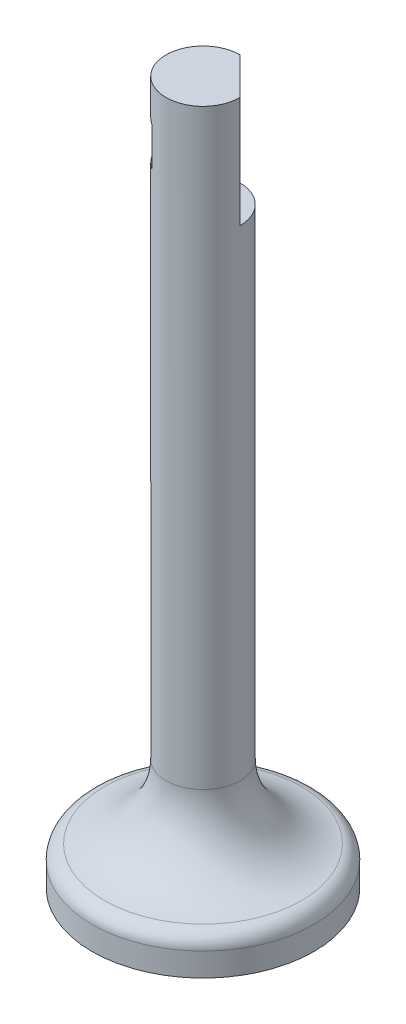
ISO-10303-21;
HEADER;
FILE_DESCRIPTION(('STEP AP214'),'2;1');
FILE_NAME('part.step','',(''),(''),'','','');
FILE_SCHEMA(('AUTOMOTIVE_DESIGN { 1 0 10303 214 1 1 1 1 }'));
ENDSEC;
DATA;
#1=APPLICATION_CONTEXT('core data for automotive mechanical design processes');
#2=APPLICATION_PROTOCOL_DEFINITION('international standard','automotive_design',2000,#1);
#3=PRODUCT_CONTEXT('',#1,'mechanical');
#4=PRODUCT('Part','Part','',(#3));
#5=PRODUCT_RELATED_PRODUCT_CATEGORY('part','',(#4));
#6=PRODUCT_DEFINITION_FORMATION('','',#4);
#7=PRODUCT_DEFINITION_CONTEXT('part definition',#1,'design');
#8=PRODUCT_DEFINITION('design','',#6,#7);
#9=PRODUCT_DEFINITION_SHAPE('','',#8);
#10=(LENGTH_UNIT() NAMED_UNIT(*) SI_UNIT(.MILLI.,.METRE.));
#11=(NAMED_UNIT(*) PLANE_ANGLE_UNIT() SI_UNIT($,.RADIAN.));
#12=(NAMED_UNIT(*) SI_UNIT($,.STERADIAN.) SOLID_ANGLE_UNIT());
#13=UNCERTAINTY_MEASURE_WITH_UNIT(LENGTH_MEASURE(1.E-05),#10,'distance_accuracy_value','');
#14=(GEOMETRIC_REPRESENTATION_CONTEXT(3) GLOBAL_UNCERTAINTY_ASSIGNED_CONTEXT((#13)) GLOBAL_UNIT_ASSIGNED_CONTEXT((#10,
#11,#12)) REPRESENTATION_CONTEXT('',''));
#15=CARTESIAN_POINT('',(0.,0.,0.));
#16=DIRECTION('',(0.,0.,1.));
#17=DIRECTION('',(1.,0.,0.));
#18=AXIS2_PLACEMENT_3D('',#15,#16,#17);
#19=CARTESIAN_POINT('',(0.,0.,0.));
#20=DIRECTION('',(0.,1.,0.));
#21=DIRECTION('',(0.,0.,1.));
#22=AXIS2_PLACEMENT_3D('',#19,#20,#21);
#23=PLANE('',#22);
#24=CARTESIAN_POINT('',(0.,0.,0.));
#25=DIRECTION('',(0.,-1.,0.));
#26=DIRECTION('',(0.,0.,-1.));
#27=AXIS2_PLACEMENT_3D('',#24,#25,#26);
#28=CIRCLE('',#27,13.5);
#29=CARTESIAN_POINT('',(0.,0.,-13.5));
#30=VERTEX_POINT('',#29);
#31=EDGE_CURVE('E301',#30,#30,#28,.T.);
#32=ORIENTED_EDGE('',*,*,#31,.F.);
#33=EDGE_LOOP('',(#32));
#34=FACE_BOUND('',#33,.T.);
#35=CARTESIAN_POINT('',(0.,0.,0.));
#36=DIRECTION('',(0.,1.,0.));
#37=DIRECTION('',(0.,0.,1.));
#38=AXIS2_PLACEMENT_3D('',#35,#36,#37);
#39=CIRCLE('',#38,15.);
#40=CARTESIAN_POINT('',(0.,0.,15.));
#41=VERTEX_POINT('',#40);
#42=EDGE_CURVE('E249',#41,#41,#39,.T.);
#43=ORIENTED_EDGE('',*,*,#42,.F.);
#44=EDGE_LOOP('',(#43));
#45=FACE_BOUND('',#44,.T.);
#46=ADVANCED_FACE('F34',(#34,#45),#23,.F.);
#47=CARTESIAN_POINT('',(0.,5.,0.));
#48=DIRECTION('',(0.,-1.,0.));
#49=DIRECTION('',(0.,0.,-1.));
#50=AXIS2_PLACEMENT_3D('',#47,#48,#49);
#51=CYLINDRICAL_SURFACE('',#50,15.);
#52=CARTESIAN_POINT('',(0.,3.16784043380077,0.));
#53=DIRECTION('',(0.,-1.,0.));
#54=DIRECTION('',(0.,0.,-1.));
#55=AXIS2_PLACEMENT_3D('',#52,#53,#54);
#56=CIRCLE('',#55,15.);
#57=CARTESIAN_POINT('',(0.,3.16784043380077,-15.));
#58=VERTEX_POINT('',#57);
#59=EDGE_CURVE('E11',#58,#58,#56,.T.);
#60=ORIENTED_EDGE('',*,*,#59,.T.);
#61=EDGE_LOOP('',(#60));
#62=FACE_BOUND('',#61,.T.);
#63=ORIENTED_EDGE('',*,*,#42,.T.);
#64=EDGE_LOOP('',(#63));
#65=FACE_BOUND('',#64,.T.);
#66=ADVANCED_FACE('F273',(#62,#65),#51,.T.);
#67=CARTESIAN_POINT('',(0.,95.,0.));
#68=DIRECTION('',(0.,-1.,0.));
#69=DIRECTION('',(0.,0.,-1.));
#70=AXIS2_PLACEMENT_3D('',#67,#68,#69);
#71=CYLINDRICAL_SURFACE('',#70,5.);
#72=CARTESIAN_POINT('',(0.,15.,0.));
#73=DIRECTION('',(0.,1.,0.));
#74=DIRECTION('',(0.,0.,1.));
#75=AXIS2_PLACEMENT_3D('',#72,#73,#74);
#76=CIRCLE('',#75,5.);
#77=CARTESIAN_POINT('',(0.,15.,5.));
#78=VERTEX_POINT('',#77);
#79=EDGE_CURVE('E252',#78,#78,#76,.T.);
#80=ORIENTED_EDGE('',*,*,#79,.T.);
#81=EDGE_LOOP('',(#80));
#82=FACE_BOUND('',#81,.T.);
#83=CARTESIAN_POINT('',(0.,90.1,0.));
#84=DIRECTION('',(0.,1.,0.));
#85=DIRECTION('',(0.,0.,1.));
#86=AXIS2_PLACEMENT_3D('',#83,#84,#85);
#87=CIRCLE('',#86,5.);
#88=CARTESIAN_POINT('',(-4.1712083963243,90.1,2.7569948339512));
#89=VERTEX_POINT('',#88);
#90=CARTESIAN_POINT('',(-2.75699483395121,90.1,4.1712083963243));
#91=VERTEX_POINT('',#90);
#92=EDGE_CURVE('E228',#89,#91,#87,.T.);
#93=ORIENTED_EDGE('',*,*,#92,.T.);
#94=DIRECTION('',(0.,-1.,0.));
#95=VECTOR('',#94,1.);
#96=CARTESIAN_POINT('',(-2.75699483395121,95.,4.1712083963243));
#97=LINE('',#96,#95);
#98=CARTESIAN_POINT('',(-2.75699483395121,84.9,4.1712083963243));
#99=VERTEX_POINT('',#98);
#100=EDGE_CURVE('E231',#91,#99,#97,.T.);
#101=ORIENTED_EDGE('',*,*,#100,.T.);
#102=CARTESIAN_POINT('',(0.,84.9,0.));
#103=DIRECTION('',(0.,-1.,0.));
#104=DIRECTION('',(0.,0.,-1.));
#105=AXIS2_PLACEMENT_3D('',#102,#103,#104);
#106=CIRCLE('',#105,5.);
#107=CARTESIAN_POINT('',(-4.1712083963243,84.9,2.75699483395121));
#108=VERTEX_POINT('',#107);
#109=EDGE_CURVE('E217',#99,#108,#106,.T.);
#110=ORIENTED_EDGE('',*,*,#109,.T.);
#111=DIRECTION('',(0.,-1.,0.));
#112=VECTOR('',#111,1.);
#113=CARTESIAN_POINT('',(-4.1712083963243,95.,2.75699483395121));
#114=LINE('',#113,#112);
#115=EDGE_CURVE('E225',#108,#89,#114,.F.);
#116=ORIENTED_EDGE('',*,*,#115,.T.);
#117=EDGE_LOOP('',(#93,#101,#110,#116));
#118=FACE_BOUND('',#117,.T.);
#119=CARTESIAN_POINT('',(0.,95.,0.));
#120=DIRECTION('',(0.,1.,0.));
#121=DIRECTION('',(0.,0.,1.));
#122=AXIS2_PLACEMENT_3D('',#119,#120,#121);
#123=CIRCLE('',#122,5.);
#124=CARTESIAN_POINT('',(0.,95.,-5.));
#125=VERTEX_POINT('',#124);
#126=CARTESIAN_POINT('',(5.,95.,0.));
#127=VERTEX_POINT('',#126);
#128=EDGE_CURVE('E245',#125,#127,#123,.T.);
#129=ORIENTED_EDGE('',*,*,#128,.F.);
#130=DIRECTION('',(0.,1.,0.));
#131=VECTOR('',#130,1.);
#132=CARTESIAN_POINT('',(0.,80.,-5.));
#133=LINE('',#132,#131);
#134=CARTESIAN_POINT('',(0.,80.,-5.));
#135=VERTEX_POINT('',#134);
#136=EDGE_CURVE('E240',#135,#125,#133,.T.);
#137=ORIENTED_EDGE('',*,*,#136,.F.);
#138=CARTESIAN_POINT('',(0.,80.,0.));
#139=DIRECTION('',(0.,1.,0.));
#140=DIRECTION('',(0.,0.,-1.));
#141=AXIS2_PLACEMENT_3D('',#138,#139,#140);
#142=CIRCLE('',#141,5.00000000000001);
#143=CARTESIAN_POINT('',(5.,80.,0.));
#144=VERTEX_POINT('',#143);
#145=EDGE_CURVE('E235',#144,#135,#142,.T.);
#146=ORIENTED_EDGE('',*,*,#145,.F.);
#147=DIRECTION('',(0.,1.,0.));
#148=VECTOR('',#147,1.);
#149=CARTESIAN_POINT('',(5.,80.,0.));
#150=LINE('',#149,#148);
#151=EDGE_CURVE('E242',#144,#127,#150,.T.);
#152=ORIENTED_EDGE('',*,*,#151,.T.);
#153=EDGE_LOOP('',(#129,#137,#146,#152));
#154=FACE_BOUND('',#153,.T.);
#155=ADVANCED_FACE('F280',(#82,#118,#154),#71,.T.);
#156=CARTESIAN_POINT('',(0.,95.,0.));
#157=DIRECTION('',(0.,1.,0.));
#158=DIRECTION('',(0.,0.,1.));
#159=AXIS2_PLACEMENT_3D('',#156,#157,#158);
#160=PLANE('',#159);
#161=DIRECTION('',(0.707106781186548,0.,0.707106781186548));
#162=VECTOR('',#161,1.);
#163=CARTESIAN_POINT('',(0.,95.,-5.));
#164=LINE('',#163,#162);
#165=EDGE_CURVE('E234',#125,#127,#164,.T.);
#166=ORIENTED_EDGE('',*,*,#165,.F.);
#167=ORIENTED_EDGE('',*,*,#128,.T.);
#168=EDGE_LOOP('',(#166,#167));
#169=FACE_BOUND('',#168,.T.);
#170=ADVANCED_FACE('F364',(#169),#160,.T.);
#171=CARTESIAN_POINT('',(0.,80.,-5.));
#172=DIRECTION('',(-0.707106781186547,0.,0.707106781186547));
#173=DIRECTION('',(0.707106781186548,0.,0.707106781186548));
#174=AXIS2_PLACEMENT_3D('',#171,#172,#173);
#175=PLANE('',#174);
#176=DIRECTION('',(-0.707106781186547,0.,-0.707106781186548));
#177=VECTOR('',#176,1.);
#178=CARTESIAN_POINT('',(1.79289321881345,84.9,-3.20710678118655));
#179=LINE('',#178,#177);
#180=CARTESIAN_POINT('',(3.20710678118655,84.9,-1.79289321881345));
#181=VERTEX_POINT('',#180);
#182=CARTESIAN_POINT('',(1.79289321881345,84.9,-3.20710678118655));
#183=VERTEX_POINT('',#182);
#184=EDGE_CURVE('E201',#181,#183,#179,.T.);
#185=ORIENTED_EDGE('',*,*,#184,.F.);
#186=DIRECTION('',(0.,-1.,0.));
#187=VECTOR('',#186,1.);
#188=CARTESIAN_POINT('',(3.20710678118655,90.1,-1.79289321881345));
#189=LINE('',#188,#187);
#190=CARTESIAN_POINT('',(3.20710678118655,90.1,-1.79289321881345));
#191=VERTEX_POINT('',#190);
#192=EDGE_CURVE('E198',#191,#181,#189,.T.);
#193=ORIENTED_EDGE('',*,*,#192,.F.);
#194=DIRECTION('',(0.707106781186547,0.,0.707106781186548));
#195=VECTOR('',#194,1.);
#196=CARTESIAN_POINT('',(1.79289321881345,90.1,-3.20710678118655));
#197=LINE('',#196,#195);
#198=CARTESIAN_POINT('',(1.79289321881345,90.1,-3.20710678118655));
#199=VERTEX_POINT('',#198);
#200=EDGE_CURVE('E211',#199,#191,#197,.T.);
#201=ORIENTED_EDGE('',*,*,#200,.F.);
#202=DIRECTION('',(0.,1.,0.));
#203=VECTOR('',#202,1.);
#204=CARTESIAN_POINT('',(1.79289321881345,90.1,-3.20710678118655));
#205=LINE('',#204,#203);
#206=EDGE_CURVE('E208',#183,#199,#205,.T.);
#207=ORIENTED_EDGE('',*,*,#206,.F.);
#208=EDGE_LOOP('',(#185,#193,#201,#207));
#209=FACE_BOUND('',#208,.T.);
#210=ORIENTED_EDGE('',*,*,#165,.T.);
#211=ORIENTED_EDGE('',*,*,#151,.F.);
#212=DIRECTION('',(0.707106781186548,0.,0.707106781186548));
#213=VECTOR('',#212,1.);
#214=CARTESIAN_POINT('',(0.,80.,-5.));
#215=LINE('',#214,#213);
#216=EDGE_CURVE('E237',#135,#144,#215,.T.);
#217=ORIENTED_EDGE('',*,*,#216,.F.);
#218=ORIENTED_EDGE('',*,*,#136,.T.);
#219=EDGE_LOOP('',(#210,#211,#217,#218));
#220=FACE_BOUND('',#219,.T.);
#221=ADVANCED_FACE('F360',(#209,#220),#175,.F.);
#222=CARTESIAN_POINT('',(0.,80.,0.));
#223=DIRECTION('',(0.,-1.,0.));
#224=DIRECTION('',(0.,0.,-1.));
#225=AXIS2_PLACEMENT_3D('',#222,#223,#224);
#226=PLANE('',#225);
#227=ORIENTED_EDGE('',*,*,#145,.T.);
#228=ORIENTED_EDGE('',*,*,#216,.T.);
#229=EDGE_LOOP('',(#227,#228));
#230=FACE_BOUND('',#229,.T.);
#231=ADVANCED_FACE('F356',(#230),#226,.F.);
#232=CARTESIAN_POINT('',(-14.2928932188135,90.1,15.7071067811865));
#233=DIRECTION('',(0.707106781186548,0.,0.707106781186548));
#234=DIRECTION('',(0.707106781186548,0.,-0.707106781186547));
#235=AXIS2_PLACEMENT_3D('',#232,#233,#234);
#236=PLANE('',#235);
#237=DIRECTION('',(0.707106781186548,0.,-0.707106781186548));
#238=VECTOR('',#237,1.);
#239=CARTESIAN_POINT('',(-14.2928932188135,90.1,15.7071067811865));
#240=LINE('',#239,#238);
#241=EDGE_CURVE('E215',#91,#191,#240,.T.);
#242=ORIENTED_EDGE('',*,*,#241,.T.);
#243=ORIENTED_EDGE('',*,*,#192,.T.);
#244=DIRECTION('',(0.707106781186548,0.,-0.707106781186548));
#245=VECTOR('',#244,1.);
#246=CARTESIAN_POINT('',(-14.2928932188135,84.9,15.7071067811865));
#247=LINE('',#246,#245);
#248=EDGE_CURVE('E214',#99,#181,#247,.T.);
#249=ORIENTED_EDGE('',*,*,#248,.F.);
#250=ORIENTED_EDGE('',*,*,#100,.F.);
#251=EDGE_LOOP('',(#242,#243,#249,#250));
#252=FACE_BOUND('',#251,.T.);
#253=ADVANCED_FACE('F347',(#252),#236,.F.);
#254=CARTESIAN_POINT('',(-15.7071067811866,90.1,14.2928932188135));
#255=DIRECTION('',(0.,1.,0.));
#256=DIRECTION('',(0.,0.,1.));
#257=AXIS2_PLACEMENT_3D('',#254,#255,#256);
#258=PLANE('',#257);
#259=DIRECTION('',(0.707106781186548,0.,-0.707106781186548));
#260=VECTOR('',#259,1.);
#261=CARTESIAN_POINT('',(-15.7071067811866,90.1,14.2928932188135));
#262=LINE('',#261,#260);
#263=EDGE_CURVE('E218',#89,#199,#262,.T.);
#264=ORIENTED_EDGE('',*,*,#263,.T.);
#265=ORIENTED_EDGE('',*,*,#200,.T.);
#266=ORIENTED_EDGE('',*,*,#241,.F.);
#267=ORIENTED_EDGE('',*,*,#92,.F.);
#268=EDGE_LOOP('',(#264,#265,#266,#267));
#269=FACE_BOUND('',#268,.T.);
#270=ADVANCED_FACE('F343',(#269),#258,.F.);
#271=CARTESIAN_POINT('',(-15.7071067811866,90.1,14.2928932188135));
#272=DIRECTION('',(-0.707106781186548,0.,-0.707106781186548));
#273=DIRECTION('',(-0.707106781186548,0.,0.707106781186547));
#274=AXIS2_PLACEMENT_3D('',#271,#272,#273);
#275=PLANE('',#274);
#276=DIRECTION('',(0.707106781186548,0.,-0.707106781186548));
#277=VECTOR('',#276,1.);
#278=CARTESIAN_POINT('',(-15.7071067811866,84.9,14.2928932188135));
#279=LINE('',#278,#277);
#280=EDGE_CURVE('E57',#108,#183,#279,.T.);
#281=ORIENTED_EDGE('',*,*,#280,.T.);
#282=ORIENTED_EDGE('',*,*,#206,.T.);
#283=ORIENTED_EDGE('',*,*,#263,.F.);
#284=ORIENTED_EDGE('',*,*,#115,.F.);
#285=EDGE_LOOP('',(#281,#282,#283,#284));
#286=FACE_BOUND('',#285,.T.);
#287=ADVANCED_FACE('F346',(#286),#275,.F.);
#288=CARTESIAN_POINT('',(-15.7071067811866,84.9,14.2928932188135));
#289=DIRECTION('',(0.,-1.,0.));
#290=DIRECTION('',(0.,0.,-1.));
#291=AXIS2_PLACEMENT_3D('',#288,#289,#290);
#292=PLANE('',#291);
#293=ORIENTED_EDGE('',*,*,#248,.T.);
#294=ORIENTED_EDGE('',*,*,#184,.T.);
#295=ORIENTED_EDGE('',*,*,#280,.F.);
#296=ORIENTED_EDGE('',*,*,#109,.F.);
#297=EDGE_LOOP('',(#293,#294,#295,#296));
#298=FACE_BOUND('',#297,.T.);
#299=ADVANCED_FACE('F270',(#298),#292,.F.);
#300=CARTESIAN_POINT('',(0.,15.,0.));
#301=DIRECTION('',(0.,1.,0.));
#302=DIRECTION('',(0.,0.,1.));
#303=AXIS2_PLACEMENT_3D('',#300,#301,#302);
#304=TOROIDAL_SURFACE('',#303,15.,10.);
#305=CARTESIAN_POINT('',(0.,5.13986702816722,0.));
#306=DIRECTION('',(0.,1.,0.));
#307=DIRECTION('',(0.,0.,1.));
#308=AXIS2_PLACEMENT_3D('',#305,#306,#307);
#309=CIRCLE('',#308,13.3333333333333);
#310=CARTESIAN_POINT('',(0.,5.13986702816722,13.3333333333333));
#311=VERTEX_POINT('',#310);
#312=EDGE_CURVE('E42',#311,#311,#309,.T.);
#313=ORIENTED_EDGE('',*,*,#312,.T.);
#314=EDGE_LOOP('',(#313));
#315=FACE_BOUND('',#314,.T.);
#316=ORIENTED_EDGE('',*,*,#79,.F.);
#317=EDGE_LOOP('',(#316));
#318=FACE_BOUND('',#317,.T.);
#319=ADVANCED_FACE('F257',(#315,#318),#304,.F.);
#320=CARTESIAN_POINT('',(0.,3.16784043380077,0.));
#321=DIRECTION('',(0.,-1.,0.));
#322=DIRECTION('',(0.,0.,-1.));
#323=AXIS2_PLACEMENT_3D('',#320,#321,#322);
#324=TOROIDAL_SURFACE('',#323,13.,2.);
#325=ORIENTED_EDGE('',*,*,#59,.F.);
#326=EDGE_LOOP('',(#325));
#327=FACE_BOUND('',#326,.T.);
#328=ORIENTED_EDGE('',*,*,#312,.F.);
#329=EDGE_LOOP('',(#328));
#330=FACE_BOUND('',#329,.T.);
#331=ADVANCED_FACE('F36',(#327,#330),#324,.T.);
#332=CARTESIAN_POINT('',(0.,1.,0.));
#333=DIRECTION('',(0.,-1.,0.));
#334=DIRECTION('',(0.,0.,-1.));
#335=AXIS2_PLACEMENT_3D('',#332,#333,#334);
#336=CYLINDRICAL_SURFACE('',#335,13.5);
#337=CARTESIAN_POINT('',(0.,1.,0.));
#338=DIRECTION('',(0.,-1.,0.));
#339=DIRECTION('',(0.,0.,-1.));
#340=AXIS2_PLACEMENT_3D('',#337,#338,#339);
#341=CIRCLE('',#340,13.5);
#342=CARTESIAN_POINT('',(0.,1.,-13.5));
#343=VERTEX_POINT('',#342);
#344=EDGE_CURVE('E304',#343,#343,#341,.T.);
#345=ORIENTED_EDGE('',*,*,#344,.F.);
#346=EDGE_LOOP('',(#345));
#347=FACE_BOUND('',#346,.T.);
#348=ORIENTED_EDGE('',*,*,#31,.T.);
#349=EDGE_LOOP('',(#348));
#350=FACE_BOUND('',#349,.T.);
#351=ADVANCED_FACE('F261',(#347,#350),#336,.F.);
#352=CARTESIAN_POINT('',(0.,1.,0.));
#353=DIRECTION('',(0.,-1.,0.));
#354=DIRECTION('',(0.,0.,-1.));
#355=AXIS2_PLACEMENT_3D('',#352,#353,#354);
#356=PLANE('',#355);
#357=CARTESIAN_POINT('',(0.,1.,0.));
#358=DIRECTION('',(0.,-1.,0.));
#359=DIRECTION('',(0.,0.,-1.));
#360=AXIS2_PLACEMENT_3D('',#357,#358,#359);
#361=CIRCLE('',#360,11.5);
#362=CARTESIAN_POINT('',(0.,1.,-11.5));
#363=VERTEX_POINT('',#362);
#364=EDGE_CURVE('E298',#363,#363,#361,.T.);
#365=ORIENTED_EDGE('',*,*,#364,.F.);
#366=EDGE_LOOP('',(#365));
#367=FACE_BOUND('',#366,.T.);
#368=ORIENTED_EDGE('',*,*,#344,.T.);
#369=EDGE_LOOP('',(#368));
#370=FACE_BOUND('',#369,.T.);
#371=ADVANCED_FACE('F267',(#367,#370),#356,.T.);
#372=CARTESIAN_POINT('',(0.,1.,0.));
#373=DIRECTION('',(0.,-1.,0.));
#374=DIRECTION('',(0.,0.,-1.));
#375=AXIS2_PLACEMENT_3D('',#372,#373,#374);
#376=CYLINDRICAL_SURFACE('',#375,11.5);
#377=ORIENTED_EDGE('',*,*,#364,.T.);
#378=EDGE_LOOP('',(#377));
#379=FACE_BOUND('',#378,.T.);
#380=CARTESIAN_POINT('',(0.,0.,0.));
#381=DIRECTION('',(0.,-1.,0.));
#382=DIRECTION('',(0.,0.,-1.));
#383=AXIS2_PLACEMENT_3D('',#380,#381,#382);
#384=CIRCLE('',#383,11.5);
#385=CARTESIAN_POINT('',(0.,0.,-11.5));
#386=VERTEX_POINT('',#385);
#387=EDGE_CURVE('E296',#386,#386,#384,.T.);
#388=ORIENTED_EDGE('',*,*,#387,.F.);
#389=EDGE_LOOP('',(#388));
#390=FACE_BOUND('',#389,.T.);
#391=ADVANCED_FACE('F564',(#379,#390),#376,.T.);
#392=CARTESIAN_POINT('',(-3.22265983268093,1.,3.52766282062939));
#393=DIRECTION('',(0.,-1.,0.));
#394=DIRECTION('',(0.,0.,-1.));
#395=AXIS2_PLACEMENT_3D('',#392,#393,#394);
#396=PLANE('',#395);
#397=DIRECTION('',(0.707106781186548,0.,0.707106781186548));
#398=VECTOR('',#397,1.);
#399=CARTESIAN_POINT('',(-2.02452217972289,1.,9.28918631926188));
#400=LINE('',#399,#398);
#401=CARTESIAN_POINT('',(-2.02452217972289,1.,9.28918631926188));
#402=VERTEX_POINT('',#401);
#403=CARTESIAN_POINT('',(-0.690387564338273,1.,10.6233209346465));
#404=VERTEX_POINT('',#403);
#405=EDGE_CURVE('E183',#402,#404,#400,.T.);
#406=ORIENTED_EDGE('',*,*,#405,.F.);
#407=DIRECTION('',(-0.707106781186548,0.,0.707106781186547));
#408=VECTOR('',#407,1.);
#409=CARTESIAN_POINT('',(6.88172782027711,1.,0.382936319261881));
#410=LINE('',#409,#408);
#411=CARTESIAN_POINT('',(6.88172782027711,1.,0.382936319261881));
#412=VERTEX_POINT('',#411);
#413=EDGE_CURVE('E622',#412,#402,#410,.T.);
#414=ORIENTED_EDGE('',*,*,#413,.F.);
#415=DIRECTION('',(0.896987446966085,0.,-0.442056014533525));
#416=VECTOR('',#415,1.);
#417=CARTESIAN_POINT('',(-5.05036352587673,1.,6.26334497310804));
#418=LINE('',#417,#416);
#419=CARTESIAN_POINT('',(-5.05036352587673,1.,6.26334497310804));
#420=VERTEX_POINT('',#419);
#421=EDGE_CURVE('E696',#420,#412,#418,.T.);
#422=ORIENTED_EDGE('',*,*,#421,.F.);
#423=DIRECTION('',(0.707106781186548,0.,0.707106781186548));
#424=VECTOR('',#423,1.);
#425=CARTESIAN_POINT('',(-6.30036352587673,1.,5.01334497310803));
#426=LINE('',#425,#424);
#427=CARTESIAN_POINT('',(-6.30036352587673,1.,5.01334497310803));
#428=VERTEX_POINT('',#427);
#429=EDGE_CURVE('E694',#428,#420,#426,.T.);
#430=ORIENTED_EDGE('',*,*,#429,.F.);
#431=DIRECTION('',(-0.435992275743932,0.,0.899950407240103));
#432=VECTOR('',#431,1.);
#433=CARTESIAN_POINT('',(-0.585219295107503,1.,-6.78353002689197));
#434=LINE('',#433,#432);
#435=CARTESIAN_POINT('',(-0.585219295107503,1.,-6.78353002689197));
#436=VERTEX_POINT('',#435);
#437=EDGE_CURVE('E692',#436,#428,#434,.T.);
#438=ORIENTED_EDGE('',*,*,#437,.F.);
#439=DIRECTION('',(0.707106781186547,0.,-0.707106781186547));
#440=VECTOR('',#439,1.);
#441=CARTESIAN_POINT('',(-9.34122891049212,1.,1.97247958849265));
#442=LINE('',#441,#440);
#443=CARTESIAN_POINT('',(-9.34122891049212,1.,1.97247958849265));
#444=VERTEX_POINT('',#443);
#445=EDGE_CURVE('E702',#444,#436,#442,.T.);
#446=ORIENTED_EDGE('',*,*,#445,.F.);
#447=DIRECTION('',(0.707106781186548,0.,0.707106781186548));
#448=VECTOR('',#447,1.);
#449=CARTESIAN_POINT('',(-10.6753635258767,1.,0.638344973108034));
#450=LINE('',#449,#448);
#451=CARTESIAN_POINT('',(-10.6753635258767,1.,0.638344973108034));
#452=VERTEX_POINT('',#451);
#453=EDGE_CURVE('E704',#452,#444,#450,.T.);
#454=ORIENTED_EDGE('',*,*,#453,.F.);
#455=DIRECTION('',(-0.707106781186548,0.,0.707106781186547));
#456=VECTOR('',#455,1.);
#457=CARTESIAN_POINT('',(-0.21262314126135,1.,-9.82439541150735));
#458=LINE('',#457,#456);
#459=CARTESIAN_POINT('',(-0.21262314126135,1.,-9.82439541150735));
#460=VERTEX_POINT('',#459);
#461=EDGE_CURVE('E706',#460,#452,#458,.T.);
#462=ORIENTED_EDGE('',*,*,#461,.F.);
#463=DIRECTION('',(-0.707106781186548,0.,-0.707106781186547));
#464=VECTOR('',#463,1.);
#465=CARTESIAN_POINT('',(1.65035762796942,1.,-7.96141464227658));
#466=LINE('',#465,#464);
#467=CARTESIAN_POINT('',(1.65035762796942,1.,-7.96141464227658));
#468=VERTEX_POINT('',#467);
#469=EDGE_CURVE('E708',#468,#460,#466,.T.);
#470=ORIENTED_EDGE('',*,*,#469,.F.);
#471=DIRECTION('',(0.438472561100651,0.,-0.898744576151554));
#472=VECTOR('',#471,1.);
#473=CARTESIAN_POINT('',(-3.1242817951075,1.,1.82524401156957));
#474=LINE('',#473,#472);
#475=CARTESIAN_POINT('',(-3.1242817951075,1.,1.82524401156957));
#476=VERTEX_POINT('',#475);
#477=EDGE_CURVE('E709',#476,#468,#474,.T.);
#478=ORIENTED_EDGE('',*,*,#477,.F.);
#479=CARTESIAN_POINT('',(-4.24507506433827,1.,4.05781612695419));
#480=CARTESIAN_POINT('',(-4.21097371825985,1.,3.99173450371307));
#481=CARTESIAN_POINT('',(-4.13866299444717,1.,3.85161070929475));
#482=CARTESIAN_POINT('',(-4.02544152604335,1.,3.6297608073729));
#483=CARTESIAN_POINT('',(-3.89798930900532,1.,3.38652834049726));
#484=CARTESIAN_POINT('',(-3.76295690197063,1.,3.11898398922079));
#485=CARTESIAN_POINT('',(-3.62014413197555,1.,2.82731651118055));
#486=CARTESIAN_POINT('',(-3.46221886441218,1.,2.51514255946133));
#487=CARTESIAN_POINT('',(-3.29789610930368,1.,2.1776414741019));
#488=CARTESIAN_POINT('',(-3.18347292975047,1.,1.94538851549004));
#489=CARTESIAN_POINT('',(-3.1242817951075,1.,1.82524401156957));
#490=B_SPLINE_CURVE_WITH_KNOTS('',3,(#479,#480,#481,#482,#483,#484,#485,#486,#487,#488,#489),
.UNSPECIFIED.,.F.,.F.,(4,1,1,1,1,1,1,1,4),(0.,0.0892987734562244,0.189354957700308,
0.299099519922024,0.419053625484989,0.549227838557973,0.689083237081833,0.839162693708516,1.),.UNSPECIFIED.);
#491=CARTESIAN_POINT('',(-4.24507506433827,1.,4.05781612695419));
#492=VERTEX_POINT('',#491);
#493=EDGE_CURVE('E317',#492,#476,#490,.T.);
#494=ORIENTED_EDGE('',*,*,#493,.F.);
#495=CARTESIAN_POINT('',(-2.19579621818443,1.,3.0061334346465));
#496=CARTESIAN_POINT('',(-2.3070295107071,1.,3.0621139044847));
#497=CARTESIAN_POINT('',(-2.52269645023915,1.,3.17065278101855));
#498=CARTESIAN_POINT('',(-2.83389067669747,1.,3.3295062218392));
#499=CARTESIAN_POINT('',(-3.1229302472731,1.,3.47757718111696));
#500=CARTESIAN_POINT('',(-3.39102233112854,1.,3.61248085581561));
#501=CARTESIAN_POINT('',(-3.63697839926641,1.,3.73762024753924));
#502=CARTESIAN_POINT('',(-3.85910859004972,1.,3.85615949389508));
#503=CARTESIAN_POINT('',(-4.05995890534908,1.,3.960316416585));
#504=CARTESIAN_POINT('',(-4.18601134259364,1.,4.02670757438442));
#505=CARTESIAN_POINT('',(-4.24507506433827,1.,4.05781612695419));
#506=B_SPLINE_CURVE_WITH_KNOTS('',3,(#495,#496,#497,#498,#499,#500,#501,#502,#503,#504,#505),
.UNSPECIFIED.,.F.,.F.,(4,1,1,1,1,1,1,1,4),(0.,0.162182512699507,0.314450874969751,
0.455051877026208,0.58514838775394,0.705331682754627,0.814449924177134,0.913057785413267,1.),.UNSPECIFIED.);
#507=CARTESIAN_POINT('',(-2.19579621818443,1.,3.0061334346465));
#508=VERTEX_POINT('',#507);
#509=EDGE_CURVE('E312',#508,#492,#506,.T.);
#510=ORIENTED_EDGE('',*,*,#509,.F.);
#511=DIRECTION('',(-0.894807751632404,0.,0.446451663249855));
#512=VECTOR('',#511,1.);
#513=CARTESIAN_POINT('',(7.68701628181557,1.,-1.92475598843043));
#514=LINE('',#513,#512);
#515=CARTESIAN_POINT('',(7.68701628181557,1.,-1.92475598843043));
#516=VERTEX_POINT('',#515);
#517=EDGE_CURVE('E310',#516,#508,#514,.T.);
#518=ORIENTED_EDGE('',*,*,#517,.F.);
#519=DIRECTION('',(-0.707106781186547,0.,-0.707106781186548));
#520=VECTOR('',#519,1.);
#521=CARTESIAN_POINT('',(9.77235282027711,1.,0.160580550031111));
#522=LINE('',#521,#520);
#523=CARTESIAN_POINT('',(9.77235282027711,1.,0.160580550031111));
#524=VERTEX_POINT('',#523);
#525=EDGE_CURVE('E185',#524,#516,#522,.T.);
#526=ORIENTED_EDGE('',*,*,#525,.F.);
#527=DIRECTION('',(0.707106781186548,0.,-0.707106781186548));
#528=VECTOR('',#527,1.);
#529=CARTESIAN_POINT('',(-0.690387564338273,1.,10.6233209346465));
#530=LINE('',#529,#528);
#531=EDGE_CURVE('E179',#404,#524,#530,.T.);
#532=ORIENTED_EDGE('',*,*,#531,.F.);
#533=EDGE_LOOP('',(#406,#414,#422,#430,#438,#446,#454,#462,#470,#478,#494,#510,#518,#526,#532));
#534=FACE_BOUND('',#533,.T.);
#535=ADVANCED_FACE('F181',(#534),#396,.T.);
#536=CARTESIAN_POINT('',(6.88172782027711,1.,0.382936319261881));
#537=DIRECTION('',(0.707106781186547,0.,0.707106781186548));
#538=DIRECTION('',(0.707106781186548,0.,-0.707106781186547));
#539=AXIS2_PLACEMENT_3D('',#536,#537,#538);
#540=PLANE('',#539);
#541=DIRECTION('',(-0.707106781186548,0.,0.707106781186547));
#542=VECTOR('',#541,1.);
#543=CARTESIAN_POINT('',(6.88172782027711,0.,0.382936319261881));
#544=LINE('',#543,#542);
#545=CARTESIAN_POINT('',(6.88172782027711,0.,0.382936319261881));
#546=VERTEX_POINT('',#545);
#547=CARTESIAN_POINT('',(-2.02452217972289,0.,9.28918631926188));
#548=VERTEX_POINT('',#547);
#549=EDGE_CURVE('E193',#546,#548,#544,.T.);
#550=ORIENTED_EDGE('',*,*,#549,.F.);
#551=DIRECTION('',(0.,-1.,0.));
#552=VECTOR('',#551,1.);
#553=CARTESIAN_POINT('',(6.88172782027711,1.,0.382936319261881));
#554=LINE('',#553,#552);
#555=EDGE_CURVE('E607',#412,#546,#554,.T.);
#556=ORIENTED_EDGE('',*,*,#555,.F.);
#557=ORIENTED_EDGE('',*,*,#413,.T.);
#558=DIRECTION('',(0.,-1.,0.));
#559=VECTOR('',#558,1.);
#560=CARTESIAN_POINT('',(-2.02452217972289,1.,9.28918631926188));
#561=LINE('',#560,#559);
#562=EDGE_CURVE('E192',#402,#548,#561,.T.);
#563=ORIENTED_EDGE('',*,*,#562,.T.);
#564=EDGE_LOOP('',(#550,#556,#557,#563));
#565=FACE_BOUND('',#564,.T.);
#566=ADVANCED_FACE('F546',(#565),#540,.T.);
#567=CARTESIAN_POINT('',(-5.05036352587673,1.,6.26334497310804));
#568=DIRECTION('',(-0.442056014533525,0.,-0.896987446966085));
#569=DIRECTION('',(-0.896987446966085,0.,0.442056014533525));
#570=AXIS2_PLACEMENT_3D('',#567,#568,#569);
#571=PLANE('',#570);
#572=DIRECTION('',(0.896987446966085,0.,-0.442056014533525));
#573=VECTOR('',#572,1.);
#574=CARTESIAN_POINT('',(-5.05036352587673,0.,6.26334497310804));
#575=LINE('',#574,#573);
#576=CARTESIAN_POINT('',(-5.05036352587673,0.,6.26334497310804));
#577=VERTEX_POINT('',#576);
#578=EDGE_CURVE('E608',#577,#546,#575,.T.);
#579=ORIENTED_EDGE('',*,*,#578,.F.);
#580=DIRECTION('',(0.,-1.,0.));
#581=VECTOR('',#580,1.);
#582=CARTESIAN_POINT('',(-5.05036352587673,1.,6.26334497310804));
#583=LINE('',#582,#581);
#584=EDGE_CURVE('E624',#420,#577,#583,.T.);
#585=ORIENTED_EDGE('',*,*,#584,.F.);
#586=ORIENTED_EDGE('',*,*,#421,.T.);
#587=ORIENTED_EDGE('',*,*,#555,.T.);
#588=EDGE_LOOP('',(#579,#585,#586,#587));
#589=FACE_BOUND('',#588,.T.);
#590=ADVANCED_FACE('F536',(#589),#571,.T.);
#591=CARTESIAN_POINT('',(-6.30036352587673,1.,5.01334497310803));
#592=DIRECTION('',(0.707106781186547,0.,-0.707106781186547));
#593=DIRECTION('',(-0.707106781186548,0.,-0.707106781186548));
#594=AXIS2_PLACEMENT_3D('',#591,#592,#593);
#595=PLANE('',#594);
#596=DIRECTION('',(0.707106781186548,0.,0.707106781186548));
#597=VECTOR('',#596,1.);
#598=CARTESIAN_POINT('',(-6.30036352587673,0.,5.01334497310803));
#599=LINE('',#598,#597);
#600=CARTESIAN_POINT('',(-6.30036352587673,0.,5.01334497310803));
#601=VERTEX_POINT('',#600);
#602=EDGE_CURVE('E614',#601,#577,#599,.T.);
#603=ORIENTED_EDGE('',*,*,#602,.F.);
#604=DIRECTION('',(0.,-1.,0.));
#605=VECTOR('',#604,1.);
#606=CARTESIAN_POINT('',(-6.30036352587673,1.,5.01334497310803));
#607=LINE('',#606,#605);
#608=EDGE_CURVE('E626',#428,#601,#607,.T.);
#609=ORIENTED_EDGE('',*,*,#608,.F.);
#610=ORIENTED_EDGE('',*,*,#429,.T.);
#611=ORIENTED_EDGE('',*,*,#584,.T.);
#612=EDGE_LOOP('',(#603,#609,#610,#611));
#613=FACE_BOUND('',#612,.T.);
#614=ADVANCED_FACE('F526',(#613),#595,.T.);
#615=CARTESIAN_POINT('',(-0.585219295107503,1.,-6.78353002689197));
#616=DIRECTION('',(0.899950407240103,0.,0.435992275743932));
#617=DIRECTION('',(0.435992275743932,0.,-0.899950407240103));
#618=AXIS2_PLACEMENT_3D('',#615,#616,#617);
#619=PLANE('',#618);
#620=DIRECTION('',(-0.435992275743932,0.,0.899950407240103));
#621=VECTOR('',#620,1.);
#622=CARTESIAN_POINT('',(-0.585219295107503,0.,-6.78353002689197));
#623=LINE('',#622,#621);
#624=CARTESIAN_POINT('',(-0.585219295107503,0.,-6.78353002689197));
#625=VERTEX_POINT('',#624);
#626=EDGE_CURVE('E617',#625,#601,#623,.T.);
#627=ORIENTED_EDGE('',*,*,#626,.F.);
#628=DIRECTION('',(0.,-1.,0.));
#629=VECTOR('',#628,1.);
#630=CARTESIAN_POINT('',(-0.585219295107503,1.,-6.78353002689197));
#631=LINE('',#630,#629);
#632=EDGE_CURVE('E628',#436,#625,#631,.T.);
#633=ORIENTED_EDGE('',*,*,#632,.F.);
#634=ORIENTED_EDGE('',*,*,#437,.T.);
#635=ORIENTED_EDGE('',*,*,#608,.T.);
#636=EDGE_LOOP('',(#627,#633,#634,#635));
#637=FACE_BOUND('',#636,.T.);
#638=ADVANCED_FACE('F516',(#637),#619,.T.);
#639=CARTESIAN_POINT('',(-9.34122891049212,1.,1.97247958849265));
#640=DIRECTION('',(-0.707106781186548,0.,-0.707106781186548));
#641=DIRECTION('',(-0.707106781186547,0.,0.707106781186548));
#642=AXIS2_PLACEMENT_3D('',#639,#640,#641);
#643=PLANE('',#642);
#644=DIRECTION('',(0.707106781186547,0.,-0.707106781186547));
#645=VECTOR('',#644,1.);
#646=CARTESIAN_POINT('',(-9.34122891049212,0.,1.97247958849265));
#647=LINE('',#646,#645);
#648=CARTESIAN_POINT('',(-9.34122891049212,0.,1.97247958849265));
#649=VERTEX_POINT('',#648);
#650=EDGE_CURVE('E685',#649,#625,#647,.T.);
#651=ORIENTED_EDGE('',*,*,#650,.F.);
#652=DIRECTION('',(0.,-1.,0.));
#653=VECTOR('',#652,1.);
#654=CARTESIAN_POINT('',(-9.34122891049212,1.,1.97247958849265));
#655=LINE('',#654,#653);
#656=EDGE_CURVE('E630',#444,#649,#655,.T.);
#657=ORIENTED_EDGE('',*,*,#656,.F.);
#658=ORIENTED_EDGE('',*,*,#445,.T.);
#659=ORIENTED_EDGE('',*,*,#632,.T.);
#660=EDGE_LOOP('',(#651,#657,#658,#659));
#661=FACE_BOUND('',#660,.T.);
#662=ADVANCED_FACE('F506',(#661),#643,.T.);
#663=CARTESIAN_POINT('',(-10.6753635258767,1.,0.638344973108034));
#664=DIRECTION('',(0.707106781186547,0.,-0.707106781186547));
#665=DIRECTION('',(-0.707106781186548,0.,-0.707106781186548));
#666=AXIS2_PLACEMENT_3D('',#663,#664,#665);
#667=PLANE('',#666);
#668=DIRECTION('',(0.707106781186548,0.,0.707106781186548));
#669=VECTOR('',#668,1.);
#670=CARTESIAN_POINT('',(-10.6753635258767,0.,0.638344973108034));
#671=LINE('',#670,#669);
#672=CARTESIAN_POINT('',(-10.6753635258767,0.,0.638344973108034));
#673=VERTEX_POINT('',#672);
#674=EDGE_CURVE('E682',#673,#649,#671,.T.);
#675=ORIENTED_EDGE('',*,*,#674,.F.);
#676=DIRECTION('',(0.,-1.,0.));
#677=VECTOR('',#676,1.);
#678=CARTESIAN_POINT('',(-10.6753635258767,1.,0.638344973108034));
#679=LINE('',#678,#677);
#680=EDGE_CURVE('E632',#452,#673,#679,.T.);
#681=ORIENTED_EDGE('',*,*,#680,.F.);
#682=ORIENTED_EDGE('',*,*,#453,.T.);
#683=ORIENTED_EDGE('',*,*,#656,.T.);
#684=EDGE_LOOP('',(#675,#681,#682,#683));
#685=FACE_BOUND('',#684,.T.);
#686=ADVANCED_FACE('F496',(#685),#667,.T.);
#687=CARTESIAN_POINT('',(-0.21262314126135,1.,-9.82439541150735));
#688=DIRECTION('',(0.707106781186547,0.,0.707106781186548));
#689=DIRECTION('',(0.707106781186548,0.,-0.707106781186547));
#690=AXIS2_PLACEMENT_3D('',#687,#688,#689);
#691=PLANE('',#690);
#692=DIRECTION('',(-0.707106781186548,0.,0.707106781186547));
#693=VECTOR('',#692,1.);
#694=CARTESIAN_POINT('',(-0.21262314126135,0.,-9.82439541150735));
#695=LINE('',#694,#693);
#696=CARTESIAN_POINT('',(-0.21262314126135,0.,-9.82439541150735));
#697=VERTEX_POINT('',#696);
#698=EDGE_CURVE('E679',#697,#673,#695,.T.);
#699=ORIENTED_EDGE('',*,*,#698,.F.);
#700=DIRECTION('',(0.,-1.,0.));
#701=VECTOR('',#700,1.);
#702=CARTESIAN_POINT('',(-0.21262314126135,1.,-9.82439541150735));
#703=LINE('',#702,#701);
#704=EDGE_CURVE('E634',#460,#697,#703,.T.);
#705=ORIENTED_EDGE('',*,*,#704,.F.);
#706=ORIENTED_EDGE('',*,*,#461,.T.);
#707=ORIENTED_EDGE('',*,*,#680,.T.);
#708=EDGE_LOOP('',(#699,#705,#706,#707));
#709=FACE_BOUND('',#708,.T.);
#710=ADVANCED_FACE('F486',(#709),#691,.T.);
#711=CARTESIAN_POINT('',(1.65035762796942,1.,-7.96141464227658));
#712=DIRECTION('',(-0.707106781186547,0.,0.707106781186548));
#713=DIRECTION('',(0.707106781186548,0.,0.707106781186547));
#714=AXIS2_PLACEMENT_3D('',#711,#712,#713);
#715=PLANE('',#714);
#716=DIRECTION('',(-0.707106781186548,0.,-0.707106781186547));
#717=VECTOR('',#716,1.);
#718=CARTESIAN_POINT('',(1.65035762796942,0.,-7.96141464227658));
#719=LINE('',#718,#717);
#720=CARTESIAN_POINT('',(1.65035762796942,0.,-7.96141464227658));
#721=VERTEX_POINT('',#720);
#722=EDGE_CURVE('E676',#721,#697,#719,.T.);
#723=ORIENTED_EDGE('',*,*,#722,.F.);
#724=DIRECTION('',(0.,-1.,0.));
#725=VECTOR('',#724,1.);
#726=CARTESIAN_POINT('',(1.65035762796942,1.,-7.96141464227658));
#727=LINE('',#726,#725);
#728=EDGE_CURVE('E636',#468,#721,#727,.T.);
#729=ORIENTED_EDGE('',*,*,#728,.F.);
#730=ORIENTED_EDGE('',*,*,#469,.T.);
#731=ORIENTED_EDGE('',*,*,#704,.T.);
#732=EDGE_LOOP('',(#723,#729,#730,#731));
#733=FACE_BOUND('',#732,.T.);
#734=ADVANCED_FACE('F477',(#733),#715,.T.);
#735=CARTESIAN_POINT('',(-3.1242817951075,1.,1.82524401156957));
#736=DIRECTION('',(-0.898744576151554,0.,-0.438472561100651));
#737=DIRECTION('',(-0.438472561100651,0.,0.898744576151554));
#738=AXIS2_PLACEMENT_3D('',#735,#736,#737);
#739=PLANE('',#738);
#740=DIRECTION('',(0.438472561100651,0.,-0.898744576151554));
#741=VECTOR('',#740,1.);
#742=CARTESIAN_POINT('',(-3.1242817951075,0.,1.82524401156957));
#743=LINE('',#742,#741);
#744=CARTESIAN_POINT('',(-3.1242817951075,0.,1.82524401156957));
#745=VERTEX_POINT('',#744);
#746=EDGE_CURVE('E670',#745,#721,#743,.T.);
#747=ORIENTED_EDGE('',*,*,#746,.F.);
#748=DIRECTION('',(0.,-1.,0.));
#749=VECTOR('',#748,1.);
#750=CARTESIAN_POINT('',(-3.1242817951075,1.,1.82524401156957));
#751=LINE('',#750,#749);
#752=EDGE_CURVE('E638',#476,#745,#751,.T.);
#753=ORIENTED_EDGE('',*,*,#752,.F.);
#754=ORIENTED_EDGE('',*,*,#477,.T.);
#755=ORIENTED_EDGE('',*,*,#728,.T.);
#756=EDGE_LOOP('',(#747,#753,#754,#755));
#757=FACE_BOUND('',#756,.T.);
#758=ADVANCED_FACE('F468',(#757),#739,.T.);
#759=DIRECTION('',(0.,-1.,0.));
#760=VECTOR('',#759,1.);
#761=SURFACE_OF_LINEAR_EXTRUSION('',#490,#760);
#762=CARTESIAN_POINT('',(-4.24507506433827,0.,4.05781612695419));
#763=CARTESIAN_POINT('',(-4.21097371825985,0.,3.99173450371307));
#764=CARTESIAN_POINT('',(-4.13866299444717,0.,3.85161070929475));
#765=CARTESIAN_POINT('',(-4.02544152604335,0.,3.6297608073729));
#766=CARTESIAN_POINT('',(-3.89798930900532,0.,3.38652834049726));
#767=CARTESIAN_POINT('',(-3.76295690197063,0.,3.11898398922079));
#768=CARTESIAN_POINT('',(-3.62014413197555,0.,2.82731651118055));
#769=CARTESIAN_POINT('',(-3.46221886441218,0.,2.51514255946133));
#770=CARTESIAN_POINT('',(-3.29789610930368,0.,2.1776414741019));
#771=CARTESIAN_POINT('',(-3.18347292975047,0.,1.94538851549004));
#772=CARTESIAN_POINT('',(-3.1242817951075,0.,1.82524401156957));
#773=B_SPLINE_CURVE_WITH_KNOTS('',3,(#762,#763,#764,#765,#766,#767,#768,#769,#770,#771,#772),
.UNSPECIFIED.,.F.,.F.,(4,1,1,1,1,1,1,1,4),(0.,0.0892987734562244,0.189354957700308,
0.299099519922024,0.419053625484989,0.549227838557973,0.689083237081833,0.839162693708516,1.),.UNSPECIFIED.);
#774=CARTESIAN_POINT('',(-4.24507506433827,0.,4.05781612695419));
#775=VERTEX_POINT('',#774);
#776=EDGE_CURVE('E662',#775,#745,#773,.T.);
#777=ORIENTED_EDGE('',*,*,#776,.F.);
#778=DIRECTION('',(0.,-1.,0.));
#779=VECTOR('',#778,1.);
#780=CARTESIAN_POINT('',(-4.24507506433827,1.,4.05781612695419));
#781=LINE('',#780,#779);
#782=EDGE_CURVE('E640',#492,#775,#781,.T.);
#783=ORIENTED_EDGE('',*,*,#782,.F.);
#784=ORIENTED_EDGE('',*,*,#493,.T.);
#785=ORIENTED_EDGE('',*,*,#752,.T.);
#786=EDGE_LOOP('',(#777,#783,#784,#785));
#787=FACE_BOUND('',#786,.T.);
#788=ADVANCED_FACE('F331',(#787),#761,.T.);
#789=DIRECTION('',(0.,-1.,0.));
#790=VECTOR('',#789,1.);
#791=SURFACE_OF_LINEAR_EXTRUSION('',#506,#790);
#792=CARTESIAN_POINT('',(-2.19579621818443,0.,3.0061334346465));
#793=CARTESIAN_POINT('',(-2.3070295107071,0.,3.0621139044847));
#794=CARTESIAN_POINT('',(-2.52269645023915,0.,3.17065278101855));
#795=CARTESIAN_POINT('',(-2.83389067669747,0.,3.3295062218392));
#796=CARTESIAN_POINT('',(-3.1229302472731,0.,3.47757718111696));
#797=CARTESIAN_POINT('',(-3.39102233112854,0.,3.61248085581561));
#798=CARTESIAN_POINT('',(-3.63697839926641,0.,3.73762024753924));
#799=CARTESIAN_POINT('',(-3.85910859004972,0.,3.85615949389508));
#800=CARTESIAN_POINT('',(-4.05995890534908,0.,3.960316416585));
#801=CARTESIAN_POINT('',(-4.18601134259364,0.,4.02670757438442));
#802=CARTESIAN_POINT('',(-4.24507506433827,0.,4.05781612695419));
#803=B_SPLINE_CURVE_WITH_KNOTS('',3,(#792,#793,#794,#795,#796,#797,#798,#799,#800,#801,#802),
.UNSPECIFIED.,.F.,.F.,(4,1,1,1,1,1,1,1,4),(0.,0.162182512699507,0.314450874969751,
0.455051877026208,0.58514838775394,0.705331682754627,0.814449924177134,0.913057785413267,1.),.UNSPECIFIED.);
#804=CARTESIAN_POINT('',(-2.19579621818443,0.,3.0061334346465));
#805=VERTEX_POINT('',#804);
#806=EDGE_CURVE('E653',#805,#775,#803,.T.);
#807=ORIENTED_EDGE('',*,*,#806,.F.);
#808=DIRECTION('',(0.,-1.,0.));
#809=VECTOR('',#808,1.);
#810=CARTESIAN_POINT('',(-2.19579621818443,1.,3.0061334346465));
#811=LINE('',#810,#809);
#812=EDGE_CURVE('E642',#508,#805,#811,.T.);
#813=ORIENTED_EDGE('',*,*,#812,.F.);
#814=ORIENTED_EDGE('',*,*,#509,.T.);
#815=ORIENTED_EDGE('',*,*,#782,.T.);
#816=EDGE_LOOP('',(#807,#813,#814,#815));
#817=FACE_BOUND('',#816,.T.);
#818=ADVANCED_FACE('F326',(#817),#791,.T.);
#819=CARTESIAN_POINT('',(7.68701628181557,1.,-1.92475598843043));
#820=DIRECTION('',(0.446451663249855,0.,0.894807751632404));
#821=DIRECTION('',(0.894807751632404,0.,-0.446451663249855));
#822=AXIS2_PLACEMENT_3D('',#819,#820,#821);
#823=PLANE('',#822);
#824=DIRECTION('',(-0.894807751632404,0.,0.446451663249855));
#825=VECTOR('',#824,1.);
#826=CARTESIAN_POINT('',(7.68701628181557,0.,-1.92475598843043));
#827=LINE('',#826,#825);
#828=CARTESIAN_POINT('',(7.68701628181557,0.,-1.92475598843043));
#829=VERTEX_POINT('',#828);
#830=EDGE_CURVE('E649',#829,#805,#827,.T.);
#831=ORIENTED_EDGE('',*,*,#830,.F.);
#832=DIRECTION('',(0.,-1.,0.));
#833=VECTOR('',#832,1.);
#834=CARTESIAN_POINT('',(7.68701628181557,1.,-1.92475598843043));
#835=LINE('',#834,#833);
#836=EDGE_CURVE('E203',#516,#829,#835,.T.);
#837=ORIENTED_EDGE('',*,*,#836,.F.);
#838=ORIENTED_EDGE('',*,*,#517,.T.);
#839=ORIENTED_EDGE('',*,*,#812,.T.);
#840=EDGE_LOOP('',(#831,#837,#838,#839));
#841=FACE_BOUND('',#840,.T.);
#842=ADVANCED_FACE('F330',(#841),#823,.T.);
#843=CARTESIAN_POINT('',(9.77235282027711,1.,0.160580550031111));
#844=DIRECTION('',(-0.707106781186548,0.,0.707106781186547));
#845=DIRECTION('',(0.707106781186547,0.,0.707106781186548));
#846=AXIS2_PLACEMENT_3D('',#843,#844,#845);
#847=PLANE('',#846);
#848=DIRECTION('',(-0.707106781186547,0.,-0.707106781186548));
#849=VECTOR('',#848,1.);
#850=CARTESIAN_POINT('',(9.77235282027711,0.,0.160580550031111));
#851=LINE('',#850,#849);
#852=CARTESIAN_POINT('',(9.77235282027711,0.,0.160580550031111));
#853=VERTEX_POINT('',#852);
#854=EDGE_CURVE('E647',#853,#829,#851,.T.);
#855=ORIENTED_EDGE('',*,*,#854,.F.);
#856=DIRECTION('',(0.,-1.,0.));
#857=VECTOR('',#856,1.);
#858=CARTESIAN_POINT('',(9.77235282027711,1.,0.160580550031111));
#859=LINE('',#858,#857);
#860=EDGE_CURVE('E199',#524,#853,#859,.T.);
#861=ORIENTED_EDGE('',*,*,#860,.F.);
#862=ORIENTED_EDGE('',*,*,#525,.T.);
#863=ORIENTED_EDGE('',*,*,#836,.T.);
#864=EDGE_LOOP('',(#855,#861,#862,#863));
#865=FACE_BOUND('',#864,.T.);
#866=ADVANCED_FACE('F336',(#865),#847,.T.);
#867=CARTESIAN_POINT('',(-0.690387564338273,1.,10.6233209346465));
#868=DIRECTION('',(-0.707106781186547,0.,-0.707106781186547));
#869=DIRECTION('',(-0.707106781186548,0.,0.707106781186548));
#870=AXIS2_PLACEMENT_3D('',#867,#868,#869);
#871=PLANE('',#870);
#872=DIRECTION('',(0.707106781186548,0.,-0.707106781186548));
#873=VECTOR('',#872,1.);
#874=CARTESIAN_POINT('',(-0.690387564338273,0.,10.6233209346465));
#875=LINE('',#874,#873);
#876=CARTESIAN_POINT('',(-0.690387564338273,0.,10.6233209346465));
#877=VERTEX_POINT('',#876);
#878=EDGE_CURVE('E197',#877,#853,#875,.T.);
#879=ORIENTED_EDGE('',*,*,#878,.F.);
#880=DIRECTION('',(0.,-1.,0.));
#881=VECTOR('',#880,1.);
#882=CARTESIAN_POINT('',(-0.690387564338273,1.,10.6233209346465));
#883=LINE('',#882,#881);
#884=EDGE_CURVE('E191',#404,#877,#883,.T.);
#885=ORIENTED_EDGE('',*,*,#884,.F.);
#886=ORIENTED_EDGE('',*,*,#531,.T.);
#887=ORIENTED_EDGE('',*,*,#860,.T.);
#888=EDGE_LOOP('',(#879,#885,#886,#887));
#889=FACE_BOUND('',#888,.T.);
#890=ADVANCED_FACE('F195',(#889),#871,.T.);
#891=CARTESIAN_POINT('',(-2.02452217972289,1.,9.28918631926188));
#892=DIRECTION('',(0.707106781186547,0.,-0.707106781186548));
#893=DIRECTION('',(-0.707106781186548,0.,-0.707106781186547));
#894=AXIS2_PLACEMENT_3D('',#891,#892,#893);
#895=PLANE('',#894);
#896=DIRECTION('',(0.707106781186548,0.,0.707106781186548));
#897=VECTOR('',#896,1.);
#898=CARTESIAN_POINT('',(-2.02452217972289,0.,9.28918631926188));
#899=LINE('',#898,#897);
#900=EDGE_CURVE('E49',#548,#877,#899,.T.);
#901=ORIENTED_EDGE('',*,*,#900,.F.);
#902=ORIENTED_EDGE('',*,*,#562,.F.);
#903=ORIENTED_EDGE('',*,*,#405,.T.);
#904=ORIENTED_EDGE('',*,*,#884,.T.);
#905=EDGE_LOOP('',(#901,#902,#903,#904));
#906=FACE_BOUND('',#905,.T.);
#907=ADVANCED_FACE('F190',(#906),#895,.T.);
#908=ORIENTED_EDGE('',*,*,#900,.T.);
#909=ORIENTED_EDGE('',*,*,#878,.T.);
#910=ORIENTED_EDGE('',*,*,#854,.T.);
#911=ORIENTED_EDGE('',*,*,#830,.T.);
#912=ORIENTED_EDGE('',*,*,#806,.T.);
#913=ORIENTED_EDGE('',*,*,#776,.T.);
#914=ORIENTED_EDGE('',*,*,#746,.T.);
#915=ORIENTED_EDGE('',*,*,#722,.T.);
#916=ORIENTED_EDGE('',*,*,#698,.T.);
#917=ORIENTED_EDGE('',*,*,#674,.T.);
#918=ORIENTED_EDGE('',*,*,#650,.T.);
#919=ORIENTED_EDGE('',*,*,#626,.T.);
#920=ORIENTED_EDGE('',*,*,#602,.T.);
#921=ORIENTED_EDGE('',*,*,#578,.T.);
#922=ORIENTED_EDGE('',*,*,#549,.T.);
#923=EDGE_LOOP('',(#908,#909,#910,#911,#912,#913,#914,#915,#916,#917,#918,#919,#920,#921,#922));
#924=FACE_BOUND('',#923,.T.);
#925=ORIENTED_EDGE('',*,*,#387,.T.);
#926=EDGE_LOOP('',(#925));
#927=FACE_BOUND('',#926,.T.);
#928=ADVANCED_FACE('F276',(#924,#927),#23,.F.);
#929=CLOSED_SHELL('',(#46,#66,#155,#170,#221,#231,#253,#270,#287,#299,#319,#331,#351,#371,#391,
#535,#566,#590,#614,#638,#662,#686,#710,#734,#758,#788,#818,#842,#866,#890,#907,#928));
#930=MANIFOLD_SOLID_BREP('B2',#929);
#931=ADVANCED_BREP_SHAPE_REPRESENTATION('',(#18,#930),#14);
#932=SHAPE_DEFINITION_REPRESENTATION(#9,#931);
ENDSEC;
END-ISO-10303-21;
